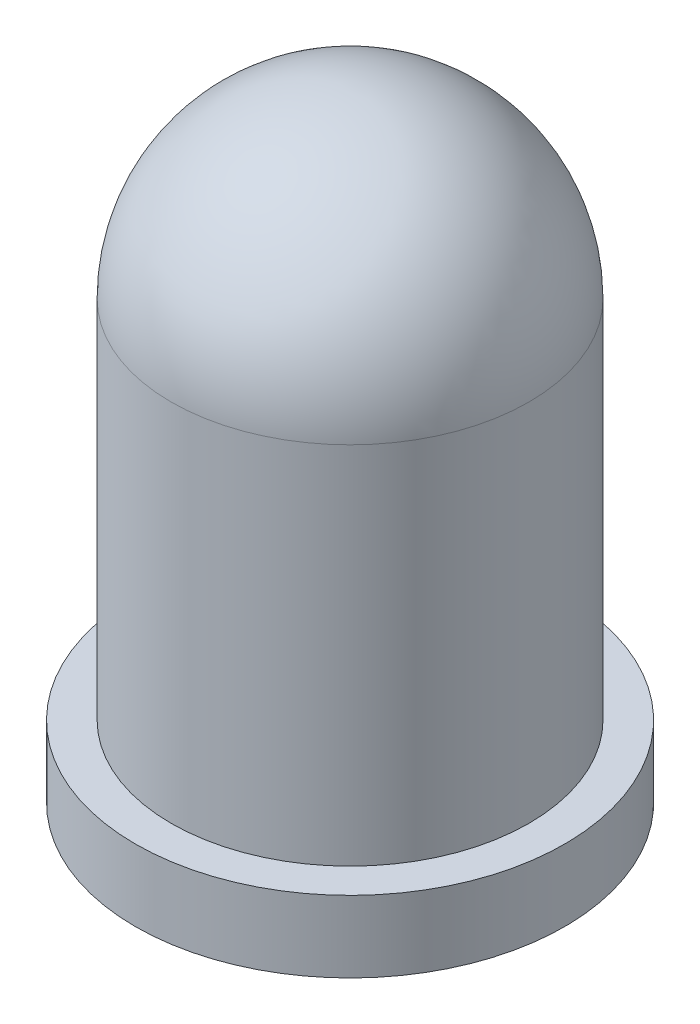
ISO-10303-21;
HEADER;
FILE_DESCRIPTION(('STEP AP214'),'2;1');
FILE_NAME('part.step','',(''),(''),'','','');
FILE_SCHEMA(('AUTOMOTIVE_DESIGN { 1 0 10303 214 1 1 1 1 }'));
ENDSEC;
DATA;
#1=APPLICATION_CONTEXT('core data for automotive mechanical design processes');
#2=APPLICATION_PROTOCOL_DEFINITION('international standard','automotive_design',2000,#1);
#3=PRODUCT_CONTEXT('',#1,'mechanical');
#4=PRODUCT('Part','Part','',(#3));
#5=PRODUCT_RELATED_PRODUCT_CATEGORY('part','',(#4));
#6=PRODUCT_DEFINITION_FORMATION('','',#4);
#7=PRODUCT_DEFINITION_CONTEXT('part definition',#1,'design');
#8=PRODUCT_DEFINITION('design','',#6,#7);
#9=PRODUCT_DEFINITION_SHAPE('','',#8);
#10=(LENGTH_UNIT() NAMED_UNIT(*) SI_UNIT(.MILLI.,.METRE.));
#11=(NAMED_UNIT(*) PLANE_ANGLE_UNIT() SI_UNIT($,.RADIAN.));
#12=(NAMED_UNIT(*) SI_UNIT($,.STERADIAN.) SOLID_ANGLE_UNIT());
#13=UNCERTAINTY_MEASURE_WITH_UNIT(LENGTH_MEASURE(1.E-05),#10,'distance_accuracy_value','');
#14=(GEOMETRIC_REPRESENTATION_CONTEXT(3) GLOBAL_UNCERTAINTY_ASSIGNED_CONTEXT((#13)) GLOBAL_UNIT_ASSIGNED_CONTEXT((#10,
#11,#12)) REPRESENTATION_CONTEXT('',''));
#15=CARTESIAN_POINT('',(0.,0.,0.));
#16=DIRECTION('',(0.,0.,1.));
#17=DIRECTION('',(1.,0.,0.));
#18=AXIS2_PLACEMENT_3D('',#15,#16,#17);
#19=CARTESIAN_POINT('',(0.,8.6,0.));
#20=DIRECTION('',(0.,-1.,0.));
#21=DIRECTION('',(0.,0.,-1.));
#22=AXIS2_PLACEMENT_3D('',#19,#20,#21);
#23=CYLINDRICAL_SURFACE('',#22,2.5);
#24=CARTESIAN_POINT('',(0.,1.,0.));
#25=DIRECTION('',(0.,1.,0.));
#26=DIRECTION('',(0.,0.,1.));
#27=AXIS2_PLACEMENT_3D('',#24,#25,#26);
#28=CIRCLE('',#27,2.5);
#29=CARTESIAN_POINT('',(0.,1.,-2.5));
#30=VERTEX_POINT('',#29);
#31=EDGE_CURVE('E36',#30,#30,#28,.T.);
#32=CARTESIAN_POINT('',(0.,6.1,0.));
#33=DIRECTION('',(0.,1.,0.));
#34=DIRECTION('',(0.,0.,1.));
#35=AXIS2_PLACEMENT_3D('',#32,#33,#34);
#36=CIRCLE('',#35,2.5);
#37=CARTESIAN_POINT('',(0.,6.1,-2.5));
#38=VERTEX_POINT('',#37);
#39=EDGE_CURVE('E11',#38,#38,#36,.T.);
#40=CARTESIAN_POINT('',(0.,1.,-2.5));
#41=CARTESIAN_POINT('',(0.,1.053125,-2.5));
#42=CARTESIAN_POINT('',(0.,1.10625,-2.5));
#43=CARTESIAN_POINT('',(0.,1.2125,-2.5));
#44=CARTESIAN_POINT('',(0.,1.265625,-2.5));
#45=CARTESIAN_POINT('',(0.,1.371875,-2.5));
#46=CARTESIAN_POINT('',(0.,1.425,-2.5));
#47=CARTESIAN_POINT('',(0.,1.53125,-2.5));
#48=CARTESIAN_POINT('',(0.,1.584375,-2.5));
#49=CARTESIAN_POINT('',(0.,1.690625,-2.5));
#50=CARTESIAN_POINT('',(0.,1.74375,-2.5));
#51=CARTESIAN_POINT('',(0.,1.85,-2.5));
#52=CARTESIAN_POINT('',(0.,1.903125,-2.5));
#53=CARTESIAN_POINT('',(0.,2.009375,-2.5));
#54=CARTESIAN_POINT('',(0.,2.0625,-2.5));
#55=CARTESIAN_POINT('',(0.,2.16875,-2.5));
#56=CARTESIAN_POINT('',(0.,2.221875,-2.5));
#57=CARTESIAN_POINT('',(0.,2.328125,-2.5));
#58=CARTESIAN_POINT('',(0.,2.38125,-2.5));
#59=CARTESIAN_POINT('',(0.,2.4875,-2.5));
#60=CARTESIAN_POINT('',(0.,2.540625,-2.5));
#61=CARTESIAN_POINT('',(0.,2.646875,-2.5));
#62=CARTESIAN_POINT('',(0.,2.7,-2.5));
#63=CARTESIAN_POINT('',(0.,2.80625,-2.5));
#64=CARTESIAN_POINT('',(0.,2.859375,-2.5));
#65=CARTESIAN_POINT('',(0.,2.965625,-2.5));
#66=CARTESIAN_POINT('',(0.,3.01875,-2.5));
#67=CARTESIAN_POINT('',(0.,3.125,-2.5));
#68=CARTESIAN_POINT('',(0.,3.178125,-2.5));
#69=CARTESIAN_POINT('',(0.,3.284375,-2.5));
#70=CARTESIAN_POINT('',(0.,3.3375,-2.5));
#71=CARTESIAN_POINT('',(0.,3.44375,-2.5));
#72=CARTESIAN_POINT('',(0.,3.496875,-2.5));
#73=CARTESIAN_POINT('',(0.,3.603125,-2.5));
#74=CARTESIAN_POINT('',(0.,3.65625,-2.5));
#75=CARTESIAN_POINT('',(0.,3.7625,-2.5));
#76=CARTESIAN_POINT('',(0.,3.815625,-2.5));
#77=CARTESIAN_POINT('',(0.,3.921875,-2.5));
#78=CARTESIAN_POINT('',(0.,3.975,-2.5));
#79=CARTESIAN_POINT('',(0.,4.08125,-2.5));
#80=CARTESIAN_POINT('',(0.,4.134375,-2.5));
#81=CARTESIAN_POINT('',(0.,4.240625,-2.5));
#82=CARTESIAN_POINT('',(0.,4.29375,-2.5));
#83=CARTESIAN_POINT('',(0.,4.4,-2.5));
#84=CARTESIAN_POINT('',(0.,4.453125,-2.5));
#85=CARTESIAN_POINT('',(0.,4.559375,-2.5));
#86=CARTESIAN_POINT('',(0.,4.6125,-2.5));
#87=CARTESIAN_POINT('',(0.,4.71875,-2.5));
#88=CARTESIAN_POINT('',(0.,4.771875,-2.5));
#89=CARTESIAN_POINT('',(0.,4.878125,-2.5));
#90=CARTESIAN_POINT('',(0.,4.93125,-2.5));
#91=CARTESIAN_POINT('',(0.,5.0375,-2.5));
#92=CARTESIAN_POINT('',(0.,5.090625,-2.5));
#93=CARTESIAN_POINT('',(0.,5.196875,-2.5));
#94=CARTESIAN_POINT('',(0.,5.25,-2.5));
#95=CARTESIAN_POINT('',(0.,5.35625,-2.5));
#96=CARTESIAN_POINT('',(0.,5.409375,-2.5));
#97=CARTESIAN_POINT('',(0.,5.515625,-2.5));
#98=CARTESIAN_POINT('',(0.,5.56875,-2.5));
#99=CARTESIAN_POINT('',(0.,5.675,-2.5));
#100=CARTESIAN_POINT('',(0.,5.728125,-2.5));
#101=CARTESIAN_POINT('',(0.,5.834375,-2.5));
#102=CARTESIAN_POINT('',(0.,5.8875,-2.5));
#103=CARTESIAN_POINT('',(0.,5.99375,-2.5));
#104=CARTESIAN_POINT('',(0.,6.046875,-2.5));
#105=CARTESIAN_POINT('',(0.,6.1,-2.5));
#106=B_SPLINE_CURVE_WITH_KNOTS('',3,(#40,#41,#42,#43,#44,#45,#46,#47,#48,#49,#50,#51,#52,#53,
#54,#55,#56,#57,#58,#59,#60,#61,#62,#63,#64,#65,#66,#67,#68,#69,#70,#71,#72,#73,#74,#75,#76,#77,
#78,#79,#80,#81,#82,#83,#84,#85,#86,#87,#88,#89,#90,#91,#92,#93,#94,#95,#96,#97,#98,#99,#100,
#101,#102,#103,#104,#105),.UNSPECIFIED.,.F.,.F.,(4,2,2,2,2,2,2,2,2,2,2,2,2,2,2,2,2,2,2,2,2,2,2,
2,2,2,2,2,2,2,2,2,4),(0.,0.159375,0.31875,0.478125,0.6375,0.796875,0.95625,1.115625,1.275,
1.434375,1.59375,1.753125,1.9125,2.071875,2.23125,2.390625,2.55,2.709375,2.86875,3.028125,
3.1875,3.346875,3.50625,3.665625,3.825,3.984375,4.14375,4.303125,4.4625,4.621875,4.78125,
4.940625,5.1),.UNSPECIFIED.);
#107=EDGE_CURVE('BSEAM33',#30,#38,#106,.T.);
#108=ORIENTED_EDGE('',*,*,#31,.T.);
#109=ORIENTED_EDGE('',*,*,#39,.F.);
#110=ORIENTED_EDGE('',*,*,#107,.T.);
#111=ORIENTED_EDGE('',*,*,#107,.F.);
#112=EDGE_LOOP('',(#108,#110,#109,#111));
#113=FACE_BOUND('',#112,.T.);
#114=ADVANCED_FACE('F33',(#113),#23,.T.);
#115=CARTESIAN_POINT('',(0.,6.1,0.));
#116=DIRECTION('',(0.,1.,0.));
#117=DIRECTION('',(-1.,0.,0.));
#118=AXIS2_PLACEMENT_3D('',#115,#116,#117);
#119=SPHERICAL_SURFACE('',#118,2.5);
#120=CARTESIAN_POINT('',(0.,8.6,0.));
#121=VERTEX_POINT('',#120);
#122=VERTEX_LOOP('',#121);
#123=FACE_BOUND('',#122,.T.);
#124=ORIENTED_EDGE('',*,*,#39,.T.);
#125=EDGE_LOOP('',(#124));
#126=FACE_BOUND('',#125,.T.);
#127=ADVANCED_FACE('F42',(#123,#126),#119,.T.);
#128=CARTESIAN_POINT('',(0.,1.,0.));
#129=DIRECTION('',(0.,-1.,0.));
#130=DIRECTION('',(0.,0.,-1.));
#131=AXIS2_PLACEMENT_3D('',#128,#129,#130);
#132=CYLINDRICAL_SURFACE('',#131,3.);
#133=CARTESIAN_POINT('',(0.,1.,0.));
#134=DIRECTION('',(0.,1.,0.));
#135=DIRECTION('',(0.,0.,1.));
#136=AXIS2_PLACEMENT_3D('',#133,#134,#135);
#137=CIRCLE('',#136,3.);
#138=CARTESIAN_POINT('',(0.,1.,3.));
#139=VERTEX_POINT('',#138);
#140=EDGE_CURVE('E56',#139,#139,#137,.T.);
#141=ORIENTED_EDGE('',*,*,#140,.F.);
#142=EDGE_LOOP('',(#141));
#143=FACE_BOUND('',#142,.T.);
#144=CARTESIAN_POINT('',(0.,0.,0.));
#145=DIRECTION('',(0.,1.,0.));
#146=DIRECTION('',(0.,0.,1.));
#147=AXIS2_PLACEMENT_3D('',#144,#145,#146);
#148=CIRCLE('',#147,3.);
#149=CARTESIAN_POINT('',(0.,0.,3.));
#150=VERTEX_POINT('',#149);
#151=EDGE_CURVE('E58',#150,#150,#148,.T.);
#152=ORIENTED_EDGE('',*,*,#151,.T.);
#153=EDGE_LOOP('',(#152));
#154=FACE_BOUND('',#153,.T.);
#155=ADVANCED_FACE('F45',(#143,#154),#132,.T.);
#156=CARTESIAN_POINT('',(0.,1.,0.));
#157=DIRECTION('',(0.,1.,0.));
#158=DIRECTION('',(0.,0.,1.));
#159=AXIS2_PLACEMENT_3D('',#156,#157,#158);
#160=PLANE('',#159);
#161=ORIENTED_EDGE('',*,*,#31,.F.);
#162=EDGE_LOOP('',(#161));
#163=FACE_BOUND('',#162,.T.);
#164=ORIENTED_EDGE('',*,*,#140,.T.);
#165=EDGE_LOOP('',(#164));
#166=FACE_BOUND('',#165,.T.);
#167=ADVANCED_FACE('F69',(#163,#166),#160,.T.);
#168=CARTESIAN_POINT('',(0.,0.,0.));
#169=DIRECTION('',(0.,1.,0.));
#170=DIRECTION('',(0.,0.,1.));
#171=AXIS2_PLACEMENT_3D('',#168,#169,#170);
#172=PLANE('',#171);
#173=ORIENTED_EDGE('',*,*,#151,.F.);
#174=EDGE_LOOP('',(#173));
#175=FACE_BOUND('',#174,.T.);
#176=ADVANCED_FACE('F67',(#175),#172,.F.);
#177=CLOSED_SHELL('',(#114,#127,#155,#167,#176));
#178=MANIFOLD_SOLID_BREP('B2',#177);
#179=ADVANCED_BREP_SHAPE_REPRESENTATION('',(#18,#178),#14);
#180=SHAPE_DEFINITION_REPRESENTATION(#9,#179);
ENDSEC;
END-ISO-10303-21;
